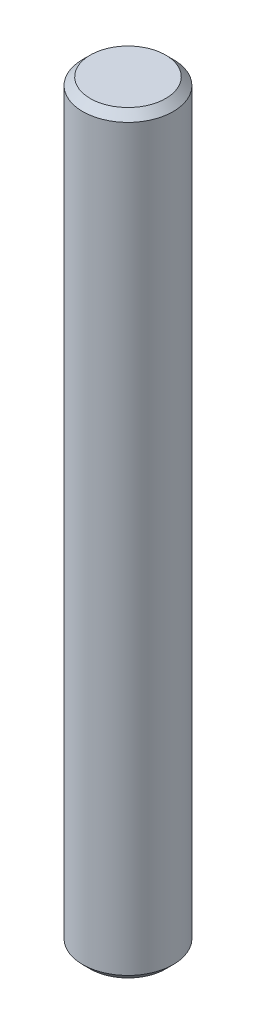
ISO-10303-21;
HEADER;
FILE_DESCRIPTION(('STEP AP214'),'2;1');
FILE_NAME('part.step','',(''),(''),'','','');
FILE_SCHEMA(('AUTOMOTIVE_DESIGN { 1 0 10303 214 1 1 1 1 }'));
ENDSEC;
DATA;
#1=APPLICATION_CONTEXT('core data for automotive mechanical design processes');
#2=APPLICATION_PROTOCOL_DEFINITION('international standard','automotive_design',2000,#1);
#3=PRODUCT_CONTEXT('',#1,'mechanical');
#4=PRODUCT('Part','Part','',(#3));
#5=PRODUCT_RELATED_PRODUCT_CATEGORY('part','',(#4));
#6=PRODUCT_DEFINITION_FORMATION('','',#4);
#7=PRODUCT_DEFINITION_CONTEXT('part definition',#1,'design');
#8=PRODUCT_DEFINITION('design','',#6,#7);
#9=PRODUCT_DEFINITION_SHAPE('','',#8);
#10=(LENGTH_UNIT() NAMED_UNIT(*) SI_UNIT(.MILLI.,.METRE.));
#11=(NAMED_UNIT(*) PLANE_ANGLE_UNIT() SI_UNIT($,.RADIAN.));
#12=(NAMED_UNIT(*) SI_UNIT($,.STERADIAN.) SOLID_ANGLE_UNIT());
#13=UNCERTAINTY_MEASURE_WITH_UNIT(LENGTH_MEASURE(1.E-05),#10,'distance_accuracy_value','');
#14=(GEOMETRIC_REPRESENTATION_CONTEXT(3) GLOBAL_UNCERTAINTY_ASSIGNED_CONTEXT((#13)) GLOBAL_UNIT_ASSIGNED_CONTEXT((#10,
#11,#12)) REPRESENTATION_CONTEXT('',''));
#15=CARTESIAN_POINT('',(0.,0.,0.));
#16=DIRECTION('',(0.,0.,1.));
#17=DIRECTION('',(1.,0.,0.));
#18=AXIS2_PLACEMENT_3D('',#15,#16,#17);
#19=CARTESIAN_POINT('',(0.,12.5,0.));
#20=DIRECTION('',(0.,-1.,0.));
#21=DIRECTION('',(0.,0.,-1.));
#22=AXIS2_PLACEMENT_3D('',#19,#20,#21);
#23=CYLINDRICAL_SURFACE('',#22,1.5);
#24=CARTESIAN_POINT('',(0.,-12.25,0.));
#25=DIRECTION('',(0.,1.,0.));
#26=DIRECTION('',(0.,0.,1.));
#27=AXIS2_PLACEMENT_3D('',#24,#25,#26);
#28=CIRCLE('',#27,1.5);
#29=CARTESIAN_POINT('',(0.,-12.25,1.5));
#30=VERTEX_POINT('',#29);
#31=EDGE_CURVE('E45',#30,#30,#28,.T.);
#32=ORIENTED_EDGE('',*,*,#31,.T.);
#33=EDGE_LOOP('',(#32));
#34=FACE_BOUND('',#33,.T.);
#35=CARTESIAN_POINT('',(0.,12.25,0.));
#36=DIRECTION('',(0.,1.,0.));
#37=DIRECTION('',(0.,0.,1.));
#38=AXIS2_PLACEMENT_3D('',#35,#36,#37);
#39=CIRCLE('',#38,1.5);
#40=CARTESIAN_POINT('',(0.,12.25,1.5));
#41=VERTEX_POINT('',#40);
#42=EDGE_CURVE('E49',#41,#41,#39,.F.);
#43=ORIENTED_EDGE('',*,*,#42,.T.);
#44=EDGE_LOOP('',(#43));
#45=FACE_BOUND('',#44,.T.);
#46=ADVANCED_FACE('F33',(#34,#45),#23,.T.);
#47=CARTESIAN_POINT('',(0.,12.5,0.));
#48=DIRECTION('',(0.,1.,0.));
#49=DIRECTION('',(0.,0.,1.));
#50=AXIS2_PLACEMENT_3D('',#47,#48,#49);
#51=PLANE('',#50);
#52=CARTESIAN_POINT('',(0.,12.5,0.));
#53=DIRECTION('',(0.,1.,0.));
#54=DIRECTION('',(0.,0.,1.));
#55=AXIS2_PLACEMENT_3D('',#52,#53,#54);
#56=CIRCLE('',#55,1.25);
#57=CARTESIAN_POINT('',(0.,12.5,1.25));
#58=VERTEX_POINT('',#57);
#59=EDGE_CURVE('E10',#58,#58,#56,.T.);
#60=ORIENTED_EDGE('',*,*,#59,.T.);
#61=EDGE_LOOP('',(#60));
#62=FACE_BOUND('',#61,.T.);
#63=ADVANCED_FACE('F65',(#62),#51,.T.);
#64=CARTESIAN_POINT('',(0.,-12.5,0.));
#65=DIRECTION('',(0.,1.,0.));
#66=DIRECTION('',(0.,0.,1.));
#67=AXIS2_PLACEMENT_3D('',#64,#65,#66);
#68=PLANE('',#67);
#69=CARTESIAN_POINT('',(0.,-12.5,0.));
#70=DIRECTION('',(0.,1.,0.));
#71=DIRECTION('',(0.,0.,1.));
#72=AXIS2_PLACEMENT_3D('',#69,#70,#71);
#73=CIRCLE('',#72,1.25);
#74=CARTESIAN_POINT('',(0.,-12.5,1.25));
#75=VERTEX_POINT('',#74);
#76=EDGE_CURVE('E41',#75,#75,#73,.F.);
#77=ORIENTED_EDGE('',*,*,#76,.T.);
#78=EDGE_LOOP('',(#77));
#79=FACE_BOUND('',#78,.T.);
#80=ADVANCED_FACE('F62',(#79),#68,.F.);
#81=CARTESIAN_POINT('',(0.,-12.25,0.));
#82=DIRECTION('',(0.,1.,0.));
#83=DIRECTION('',(0.,0.,1.));
#84=AXIS2_PLACEMENT_3D('',#81,#82,#83);
#85=CONICAL_SURFACE('',#84,1.5,0.785398163397441);
#86=ORIENTED_EDGE('',*,*,#76,.F.);
#87=EDGE_LOOP('',(#86));
#88=FACE_BOUND('',#87,.T.);
#89=ORIENTED_EDGE('',*,*,#31,.F.);
#90=EDGE_LOOP('',(#89));
#91=FACE_BOUND('',#90,.T.);
#92=ADVANCED_FACE('F58',(#88,#91),#85,.T.);
#93=CARTESIAN_POINT('',(0.,12.5,0.));
#94=DIRECTION('',(0.,-1.,0.));
#95=DIRECTION('',(0.,0.,-1.));
#96=AXIS2_PLACEMENT_3D('',#93,#94,#95);
#97=CONICAL_SURFACE('',#96,1.25,0.785398163397445);
#98=ORIENTED_EDGE('',*,*,#42,.F.);
#99=EDGE_LOOP('',(#98));
#100=FACE_BOUND('',#99,.T.);
#101=ORIENTED_EDGE('',*,*,#59,.F.);
#102=EDGE_LOOP('',(#101));
#103=FACE_BOUND('',#102,.T.);
#104=ADVANCED_FACE('F36',(#100,#103),#97,.T.);
#105=CLOSED_SHELL('',(#46,#63,#80,#92,#104));
#106=MANIFOLD_SOLID_BREP('B2',#105);
#107=ADVANCED_BREP_SHAPE_REPRESENTATION('',(#18,#106),#14);
#108=SHAPE_DEFINITION_REPRESENTATION(#9,#107);
ENDSEC;
END-ISO-10303-21;
